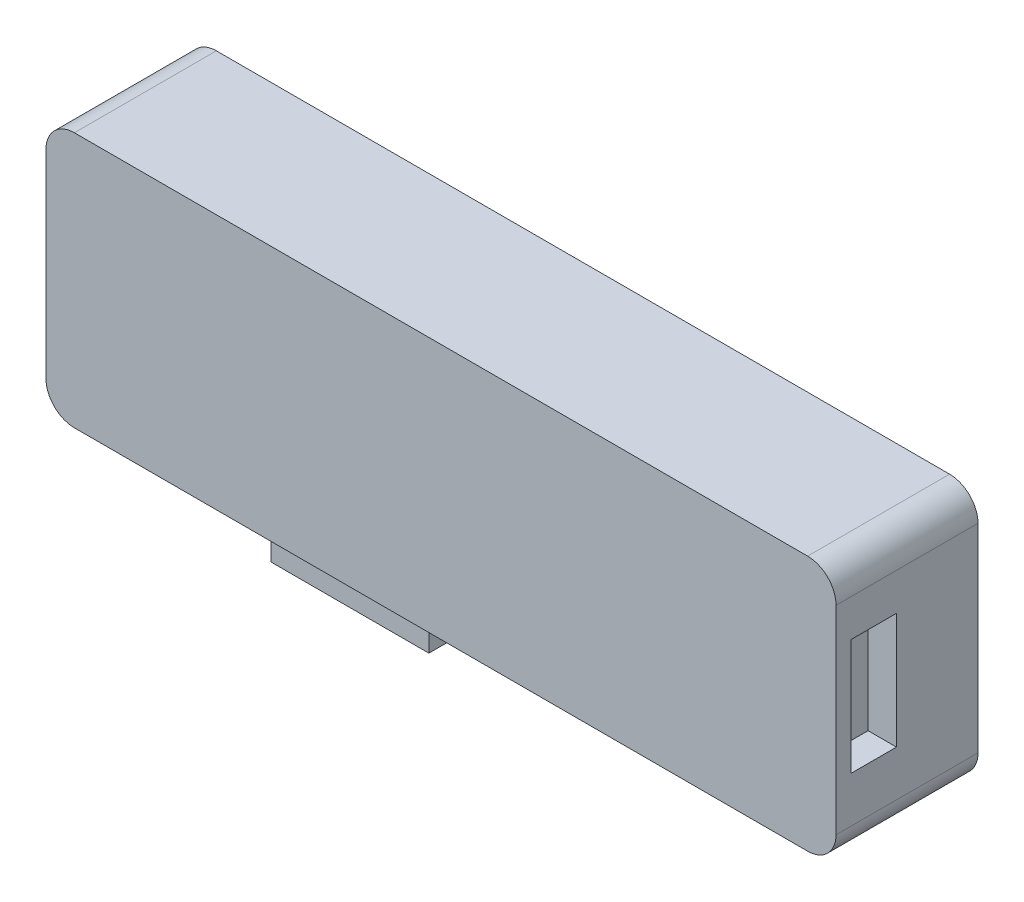
ISO-10303-21;
HEADER;
FILE_DESCRIPTION(('STEP AP214'),'2;1');
FILE_NAME('part.step','',(''),(''),'','','');
FILE_SCHEMA(('AUTOMOTIVE_DESIGN { 1 0 10303 214 1 1 1 1 }'));
ENDSEC;
DATA;
#1=APPLICATION_CONTEXT('core data for automotive mechanical design processes');
#2=APPLICATION_PROTOCOL_DEFINITION('international standard','automotive_design',2000,#1);
#3=PRODUCT_CONTEXT('',#1,'mechanical');
#4=PRODUCT('Part','Part','',(#3));
#5=PRODUCT_RELATED_PRODUCT_CATEGORY('part','',(#4));
#6=PRODUCT_DEFINITION_FORMATION('','',#4);
#7=PRODUCT_DEFINITION_CONTEXT('part definition',#1,'design');
#8=PRODUCT_DEFINITION('design','',#6,#7);
#9=PRODUCT_DEFINITION_SHAPE('','',#8);
#10=(LENGTH_UNIT() NAMED_UNIT(*) SI_UNIT(.MILLI.,.METRE.));
#11=(NAMED_UNIT(*) PLANE_ANGLE_UNIT() SI_UNIT($,.RADIAN.));
#12=(NAMED_UNIT(*) SI_UNIT($,.STERADIAN.) SOLID_ANGLE_UNIT());
#13=UNCERTAINTY_MEASURE_WITH_UNIT(LENGTH_MEASURE(1.E-05),#10,'distance_accuracy_value','');
#14=(GEOMETRIC_REPRESENTATION_CONTEXT(3) GLOBAL_UNCERTAINTY_ASSIGNED_CONTEXT((#13)) GLOBAL_UNIT_ASSIGNED_CONTEXT((#10,
#11,#12)) REPRESENTATION_CONTEXT('',''));
#15=CARTESIAN_POINT('',(0.,0.,0.));
#16=DIRECTION('',(0.,0.,1.));
#17=DIRECTION('',(1.,0.,0.));
#18=AXIS2_PLACEMENT_3D('',#15,#16,#17);
#19=CARTESIAN_POINT('',(-19.05,-11.43,-12.7));
#20=DIRECTION('',(0.,-1.,0.));
#21=DIRECTION('',(0.,0.,-1.));
#22=AXIS2_PLACEMENT_3D('',#19,#20,#21);
#23=PLANE('',#22);
#24=DIRECTION('',(1.,0.,0.));
#25=VECTOR('',#24,1.);
#26=CARTESIAN_POINT('',(-19.05,-11.43,0.));
#27=LINE('',#26,#25);
#28=CARTESIAN_POINT('',(-19.05,-11.43,0.));
#29=VERTEX_POINT('',#28);
#30=CARTESIAN_POINT('',(46.5422120971679,-11.43,0.));
#31=VERTEX_POINT('',#30);
#32=EDGE_CURVE('E232',#29,#31,#27,.T.);
#33=ORIENTED_EDGE('',*,*,#32,.F.);
#34=DIRECTION('',(0.,0.,1.));
#35=VECTOR('',#34,1.);
#36=CARTESIAN_POINT('',(-19.05,-11.43,-12.7));
#37=LINE('',#36,#35);
#38=CARTESIAN_POINT('',(-19.05,-11.43,-12.7));
#39=VERTEX_POINT('',#38);
#40=EDGE_CURVE('E11',#39,#29,#37,.T.);
#41=ORIENTED_EDGE('',*,*,#40,.F.);
#42=DIRECTION('',(1.,0.,0.));
#43=VECTOR('',#42,1.);
#44=CARTESIAN_POINT('',(-19.05,-11.43,-12.7));
#45=LINE('',#44,#43);
#46=CARTESIAN_POINT('',(46.5422120971679,-11.43,-12.7));
#47=VERTEX_POINT('',#46);
#48=EDGE_CURVE('E239',#39,#47,#45,.T.);
#49=ORIENTED_EDGE('',*,*,#48,.T.);
#50=DIRECTION('',(0.,0.,1.));
#51=VECTOR('',#50,1.);
#52=CARTESIAN_POINT('',(46.5422120971679,-11.43,-12.7));
#53=LINE('',#52,#51);
#54=EDGE_CURVE('E37',#47,#31,#53,.T.);
#55=ORIENTED_EDGE('',*,*,#54,.T.);
#56=EDGE_LOOP('',(#33,#41,#49,#55));
#57=FACE_BOUND('',#56,.T.);
#58=DIRECTION('',(-1.,0.,0.));
#59=VECTOR('',#58,1.);
#60=CARTESIAN_POINT('',(9.864,-11.43,-2.794));
#61=LINE('',#60,#59);
#62=CARTESIAN_POINT('',(9.864,-11.43,-2.794));
#63=VERTEX_POINT('',#62);
#64=CARTESIAN_POINT('',(-4.276,-11.43,-2.794));
#65=VERTEX_POINT('',#64);
#66=EDGE_CURVE('E187',#63,#65,#61,.T.);
#67=ORIENTED_EDGE('',*,*,#66,.F.);
#68=DIRECTION('',(0.,0.,1.));
#69=VECTOR('',#68,1.);
#70=CARTESIAN_POINT('',(9.864,-11.43,-2.794));
#71=LINE('',#70,#69);
#72=CARTESIAN_POINT('',(9.864,-11.43,-9.334));
#73=VERTEX_POINT('',#72);
#74=EDGE_CURVE('E181',#73,#63,#71,.T.);
#75=ORIENTED_EDGE('',*,*,#74,.F.);
#76=DIRECTION('',(1.,0.,0.));
#77=VECTOR('',#76,1.);
#78=CARTESIAN_POINT('',(9.864,-11.43,-9.334));
#79=LINE('',#78,#77);
#80=CARTESIAN_POINT('',(-4.276,-11.43,-9.334));
#81=VERTEX_POINT('',#80);
#82=EDGE_CURVE('E591',#81,#73,#79,.T.);
#83=ORIENTED_EDGE('',*,*,#82,.F.);
#84=DIRECTION('',(0.,0.,-1.));
#85=VECTOR('',#84,1.);
#86=CARTESIAN_POINT('',(-4.276,-11.43,-2.794));
#87=LINE('',#86,#85);
#88=EDGE_CURVE('E50',#65,#81,#87,.T.);
#89=ORIENTED_EDGE('',*,*,#88,.F.);
#90=EDGE_LOOP('',(#67,#75,#83,#89));
#91=FACE_BOUND('',#90,.T.);
#92=ADVANCED_FACE('F33',(#57,#91),#23,.T.);
#93=CARTESIAN_POINT('',(-19.05,-8.89,-12.7));
#94=DIRECTION('',(0.,0.,1.));
#95=DIRECTION('',(1.,0.,0.));
#96=AXIS2_PLACEMENT_3D('',#93,#94,#95);
#97=CYLINDRICAL_SURFACE('',#96,2.54);
#98=CARTESIAN_POINT('',(-19.05,-8.89,0.));
#99=DIRECTION('',(0.,0.,-1.));
#100=DIRECTION('',(-1.,0.,0.));
#101=AXIS2_PLACEMENT_3D('',#98,#99,#100);
#102=CIRCLE('',#101,2.54);
#103=CARTESIAN_POINT('',(-21.59,-8.88999999999998,0.));
#104=VERTEX_POINT('',#103);
#105=EDGE_CURVE('E243',#29,#104,#102,.T.);
#106=ORIENTED_EDGE('',*,*,#105,.T.);
#107=DIRECTION('',(0.,0.,1.));
#108=VECTOR('',#107,1.);
#109=CARTESIAN_POINT('',(-21.59,-8.88999999999998,-12.7));
#110=LINE('',#109,#108);
#111=CARTESIAN_POINT('',(-21.59,-8.88999999999998,-12.7));
#112=VERTEX_POINT('',#111);
#113=EDGE_CURVE('E42',#112,#104,#110,.T.);
#114=ORIENTED_EDGE('',*,*,#113,.F.);
#115=CARTESIAN_POINT('',(-19.05,-8.89,-12.7));
#116=DIRECTION('',(0.,0.,-1.));
#117=DIRECTION('',(-1.,0.,0.));
#118=AXIS2_PLACEMENT_3D('',#115,#116,#117);
#119=CIRCLE('',#118,2.54);
#120=EDGE_CURVE('E257',#39,#112,#119,.T.);
#121=ORIENTED_EDGE('',*,*,#120,.F.);
#122=ORIENTED_EDGE('',*,*,#40,.T.);
#123=EDGE_LOOP('',(#106,#114,#121,#122));
#124=FACE_BOUND('',#123,.T.);
#125=ADVANCED_FACE('F306',(#124),#97,.T.);
#126=CARTESIAN_POINT('',(-21.59,-8.88999999999998,-12.7));
#127=DIRECTION('',(1.,0.,0.));
#128=DIRECTION('',(0.,0.,-1.));
#129=AXIS2_PLACEMENT_3D('',#126,#127,#128);
#130=PLANE('',#129);
#131=DIRECTION('',(0.,1.,0.));
#132=VECTOR('',#131,1.);
#133=CARTESIAN_POINT('',(-21.59,-8.88999999999998,0.));
#134=LINE('',#133,#132);
#135=CARTESIAN_POINT('',(-21.59,8.88999999999998,0.));
#136=VERTEX_POINT('',#135);
#137=EDGE_CURVE('E274',#104,#136,#134,.T.);
#138=ORIENTED_EDGE('',*,*,#137,.T.);
#139=DIRECTION('',(0.,0.,1.));
#140=VECTOR('',#139,1.);
#141=CARTESIAN_POINT('',(-21.59,8.88999999999998,-12.7));
#142=LINE('',#141,#140);
#143=CARTESIAN_POINT('',(-21.59,8.88999999999998,-12.7));
#144=VERTEX_POINT('',#143);
#145=EDGE_CURVE('E279',#144,#136,#142,.T.);
#146=ORIENTED_EDGE('',*,*,#145,.F.);
#147=DIRECTION('',(0.,1.,0.));
#148=VECTOR('',#147,1.);
#149=CARTESIAN_POINT('',(-21.59,-8.88999999999998,-12.7));
#150=LINE('',#149,#148);
#151=EDGE_CURVE('E255',#112,#144,#150,.T.);
#152=ORIENTED_EDGE('',*,*,#151,.F.);
#153=ORIENTED_EDGE('',*,*,#113,.T.);
#154=EDGE_LOOP('',(#138,#146,#152,#153));
#155=FACE_BOUND('',#154,.T.);
#156=ADVANCED_FACE('F310',(#155),#130,.F.);
#157=CARTESIAN_POINT('',(-19.05,8.89,-12.7));
#158=DIRECTION('',(0.,0.,1.));
#159=DIRECTION('',(1.,0.,0.));
#160=AXIS2_PLACEMENT_3D('',#157,#158,#159);
#161=CYLINDRICAL_SURFACE('',#160,2.54);
#162=CARTESIAN_POINT('',(-19.05,8.89,0.));
#163=DIRECTION('',(0.,0.,-1.));
#164=DIRECTION('',(-1.,0.,0.));
#165=AXIS2_PLACEMENT_3D('',#162,#163,#164);
#166=CIRCLE('',#165,2.54);
#167=CARTESIAN_POINT('',(-19.05,11.43,0.));
#168=VERTEX_POINT('',#167);
#169=EDGE_CURVE('E272',#136,#168,#166,.T.);
#170=ORIENTED_EDGE('',*,*,#169,.T.);
#171=DIRECTION('',(0.,0.,1.));
#172=VECTOR('',#171,1.);
#173=CARTESIAN_POINT('',(-19.05,11.43,-12.7));
#174=LINE('',#173,#172);
#175=CARTESIAN_POINT('',(-19.05,11.43,-12.7));
#176=VERTEX_POINT('',#175);
#177=EDGE_CURVE('E282',#176,#168,#174,.T.);
#178=ORIENTED_EDGE('',*,*,#177,.F.);
#179=CARTESIAN_POINT('',(-19.05,8.89,-12.7));
#180=DIRECTION('',(0.,0.,-1.));
#181=DIRECTION('',(-1.,0.,0.));
#182=AXIS2_PLACEMENT_3D('',#179,#180,#181);
#183=CIRCLE('',#182,2.54);
#184=EDGE_CURVE('E253',#144,#176,#183,.T.);
#185=ORIENTED_EDGE('',*,*,#184,.F.);
#186=ORIENTED_EDGE('',*,*,#145,.T.);
#187=EDGE_LOOP('',(#170,#178,#185,#186));
#188=FACE_BOUND('',#187,.T.);
#189=ADVANCED_FACE('F330',(#188),#161,.T.);
#190=CARTESIAN_POINT('',(-19.05,11.43,-12.7));
#191=DIRECTION('',(0.,-1.,0.));
#192=DIRECTION('',(0.,0.,-1.));
#193=AXIS2_PLACEMENT_3D('',#190,#191,#192);
#194=PLANE('',#193);
#195=DIRECTION('',(1.,0.,0.));
#196=VECTOR('',#195,1.);
#197=CARTESIAN_POINT('',(-19.05,11.43,0.));
#198=LINE('',#197,#196);
#199=CARTESIAN_POINT('',(46.5422120971679,11.43,0.));
#200=VERTEX_POINT('',#199);
#201=EDGE_CURVE('E270',#168,#200,#198,.T.);
#202=ORIENTED_EDGE('',*,*,#201,.T.);
#203=DIRECTION('',(0.,0.,1.));
#204=VECTOR('',#203,1.);
#205=CARTESIAN_POINT('',(46.5422120971679,11.43,-12.7));
#206=LINE('',#205,#204);
#207=CARTESIAN_POINT('',(46.5422120971679,11.43,-12.7));
#208=VERTEX_POINT('',#207);
#209=EDGE_CURVE('E285',#208,#200,#206,.T.);
#210=ORIENTED_EDGE('',*,*,#209,.F.);
#211=DIRECTION('',(1.,0.,0.));
#212=VECTOR('',#211,1.);
#213=CARTESIAN_POINT('',(-19.05,11.43,-12.7));
#214=LINE('',#213,#212);
#215=EDGE_CURVE('E251',#176,#208,#214,.T.);
#216=ORIENTED_EDGE('',*,*,#215,.F.);
#217=ORIENTED_EDGE('',*,*,#177,.T.);
#218=EDGE_LOOP('',(#202,#210,#216,#217));
#219=FACE_BOUND('',#218,.T.);
#220=ADVANCED_FACE('F328',(#219),#194,.F.);
#221=CARTESIAN_POINT('',(46.542212097168,8.89,-12.7));
#222=DIRECTION('',(0.,0.,1.));
#223=DIRECTION('',(1.,0.,0.));
#224=AXIS2_PLACEMENT_3D('',#221,#222,#223);
#225=CYLINDRICAL_SURFACE('',#224,2.54);
#226=CARTESIAN_POINT('',(46.542212097168,8.89,0.));
#227=DIRECTION('',(0.,0.,-1.));
#228=DIRECTION('',(-1.,0.,0.));
#229=AXIS2_PLACEMENT_3D('',#226,#227,#228);
#230=CIRCLE('',#229,2.54);
#231=CARTESIAN_POINT('',(49.082212097168,8.88999999999998,0.));
#232=VERTEX_POINT('',#231);
#233=EDGE_CURVE('E267',#200,#232,#230,.T.);
#234=ORIENTED_EDGE('',*,*,#233,.T.);
#235=DIRECTION('',(0.,0.,1.));
#236=VECTOR('',#235,1.);
#237=CARTESIAN_POINT('',(49.082212097168,8.88999999999998,-12.7));
#238=LINE('',#237,#236);
#239=CARTESIAN_POINT('',(49.082212097168,8.88999999999998,-12.7));
#240=VERTEX_POINT('',#239);
#241=EDGE_CURVE('E288',#240,#232,#238,.T.);
#242=ORIENTED_EDGE('',*,*,#241,.F.);
#243=CARTESIAN_POINT('',(46.542212097168,8.89,-12.7));
#244=DIRECTION('',(0.,0.,-1.));
#245=DIRECTION('',(-1.,0.,0.));
#246=AXIS2_PLACEMENT_3D('',#243,#244,#245);
#247=CIRCLE('',#246,2.54);
#248=EDGE_CURVE('E249',#208,#240,#247,.T.);
#249=ORIENTED_EDGE('',*,*,#248,.F.);
#250=ORIENTED_EDGE('',*,*,#209,.T.);
#251=EDGE_LOOP('',(#234,#242,#249,#250));
#252=FACE_BOUND('',#251,.T.);
#253=ADVANCED_FACE('F324',(#252),#225,.T.);
#254=CARTESIAN_POINT('',(49.082212097168,-8.88999999999998,-12.7));
#255=DIRECTION('',(1.,0.,0.));
#256=DIRECTION('',(0.,0.,-1.));
#257=AXIS2_PLACEMENT_3D('',#254,#255,#256);
#258=PLANE('',#257);
#259=DIRECTION('',(0.,1.,0.));
#260=VECTOR('',#259,1.);
#261=CARTESIAN_POINT('',(49.082212097168,-4.7991640521255,-5.40803669244056));
#262=LINE('',#261,#260);
#263=CARTESIAN_POINT('',(49.082212097168,-4.7991640521255,-5.40803669244056));
#264=VERTEX_POINT('',#263);
#265=CARTESIAN_POINT('',(49.082212097168,5.56528687011896,-5.40803669244056));
#266=VERTEX_POINT('',#265);
#267=EDGE_CURVE('E204',#264,#266,#262,.T.);
#268=ORIENTED_EDGE('',*,*,#267,.F.);
#269=DIRECTION('',(0.,0.,-1.));
#270=VECTOR('',#269,1.);
#271=CARTESIAN_POINT('',(49.082212097168,-4.7991640521255,-1.31739544409521));
#272=LINE('',#271,#270);
#273=CARTESIAN_POINT('',(49.082212097168,-4.7991640521255,-1.31739544409521));
#274=VERTEX_POINT('',#273);
#275=EDGE_CURVE('E211',#274,#264,#272,.T.);
#276=ORIENTED_EDGE('',*,*,#275,.F.);
#277=DIRECTION('',(0.,-1.,0.));
#278=VECTOR('',#277,1.);
#279=CARTESIAN_POINT('',(49.082212097168,-4.7991640521255,-1.31739544409521));
#280=LINE('',#279,#278);
#281=CARTESIAN_POINT('',(49.082212097168,5.56528687011896,-1.31739544409521));
#282=VERTEX_POINT('',#281);
#283=EDGE_CURVE('E225',#282,#274,#280,.T.);
#284=ORIENTED_EDGE('',*,*,#283,.F.);
#285=DIRECTION('',(0.,0.,1.));
#286=VECTOR('',#285,1.);
#287=CARTESIAN_POINT('',(49.082212097168,5.56528687011896,-1.31739544409521));
#288=LINE('',#287,#286);
#289=EDGE_CURVE('E222',#266,#282,#288,.T.);
#290=ORIENTED_EDGE('',*,*,#289,.F.);
#291=EDGE_LOOP('',(#268,#276,#284,#290));
#292=FACE_BOUND('',#291,.T.);
#293=DIRECTION('',(0.,1.,0.));
#294=VECTOR('',#293,1.);
#295=CARTESIAN_POINT('',(49.082212097168,-8.88999999999998,0.));
#296=LINE('',#295,#294);
#297=CARTESIAN_POINT('',(49.082212097168,-8.88999999999998,0.));
#298=VERTEX_POINT('',#297);
#299=EDGE_CURVE('E264',#298,#232,#296,.T.);
#300=ORIENTED_EDGE('',*,*,#299,.F.);
#301=DIRECTION('',(0.,0.,1.));
#302=VECTOR('',#301,1.);
#303=CARTESIAN_POINT('',(49.082212097168,-8.88999999999998,-12.7));
#304=LINE('',#303,#302);
#305=CARTESIAN_POINT('',(49.082212097168,-8.88999999999998,-12.7));
#306=VERTEX_POINT('',#305);
#307=EDGE_CURVE('E289',#306,#298,#304,.T.);
#308=ORIENTED_EDGE('',*,*,#307,.F.);
#309=DIRECTION('',(0.,1.,0.));
#310=VECTOR('',#309,1.);
#311=CARTESIAN_POINT('',(49.082212097168,-8.88999999999998,-12.7));
#312=LINE('',#311,#310);
#313=EDGE_CURVE('E246',#306,#240,#312,.T.);
#314=ORIENTED_EDGE('',*,*,#313,.T.);
#315=ORIENTED_EDGE('',*,*,#241,.T.);
#316=EDGE_LOOP('',(#300,#308,#314,#315));
#317=FACE_BOUND('',#316,.T.);
#318=ADVANCED_FACE('F320',(#292,#317),#258,.T.);
#319=CARTESIAN_POINT('',(46.542212097168,-8.89,-12.7));
#320=DIRECTION('',(0.,0.,1.));
#321=DIRECTION('',(1.,0.,0.));
#322=AXIS2_PLACEMENT_3D('',#319,#320,#321);
#323=CYLINDRICAL_SURFACE('',#322,2.54);
#324=CARTESIAN_POINT('',(46.542212097168,-8.89,0.));
#325=DIRECTION('',(0.,0.,1.));
#326=DIRECTION('',(1.,0.,0.));
#327=AXIS2_PLACEMENT_3D('',#324,#325,#326);
#328=CIRCLE('',#327,2.54);
#329=EDGE_CURVE('E261',#31,#298,#328,.T.);
#330=ORIENTED_EDGE('',*,*,#329,.F.);
#331=ORIENTED_EDGE('',*,*,#54,.F.);
#332=CARTESIAN_POINT('',(46.542212097168,-8.89,-12.7));
#333=DIRECTION('',(0.,0.,1.));
#334=DIRECTION('',(1.,0.,0.));
#335=AXIS2_PLACEMENT_3D('',#332,#333,#334);
#336=CIRCLE('',#335,2.54);
#337=EDGE_CURVE('E242',#47,#306,#336,.T.);
#338=ORIENTED_EDGE('',*,*,#337,.T.);
#339=ORIENTED_EDGE('',*,*,#307,.T.);
#340=EDGE_LOOP('',(#330,#331,#338,#339));
#341=FACE_BOUND('',#340,.T.);
#342=ADVANCED_FACE('F298',(#341),#323,.T.);
#343=CARTESIAN_POINT('',(46.542212097168,-8.89,-12.7));
#344=DIRECTION('',(0.,0.,1.));
#345=DIRECTION('',(1.,0.,0.));
#346=AXIS2_PLACEMENT_3D('',#343,#344,#345);
#347=PLANE('',#346);
#348=ORIENTED_EDGE('',*,*,#48,.F.);
#349=ORIENTED_EDGE('',*,*,#120,.T.);
#350=ORIENTED_EDGE('',*,*,#151,.T.);
#351=ORIENTED_EDGE('',*,*,#184,.T.);
#352=ORIENTED_EDGE('',*,*,#215,.T.);
#353=ORIENTED_EDGE('',*,*,#248,.T.);
#354=ORIENTED_EDGE('',*,*,#313,.F.);
#355=ORIENTED_EDGE('',*,*,#337,.F.);
#356=EDGE_LOOP('',(#348,#349,#350,#351,#352,#353,#354,#355));
#357=FACE_BOUND('',#356,.T.);
#358=ADVANCED_FACE('F314',(#357),#347,.F.);
#359=CARTESIAN_POINT('',(46.542212097168,-8.89,0.));
#360=DIRECTION('',(0.,0.,1.));
#361=DIRECTION('',(1.,0.,0.));
#362=AXIS2_PLACEMENT_3D('',#359,#360,#361);
#363=PLANE('',#362);
#364=ORIENTED_EDGE('',*,*,#32,.T.);
#365=ORIENTED_EDGE('',*,*,#329,.T.);
#366=ORIENTED_EDGE('',*,*,#299,.T.);
#367=ORIENTED_EDGE('',*,*,#233,.F.);
#368=ORIENTED_EDGE('',*,*,#201,.F.);
#369=ORIENTED_EDGE('',*,*,#169,.F.);
#370=ORIENTED_EDGE('',*,*,#137,.F.);
#371=ORIENTED_EDGE('',*,*,#105,.F.);
#372=EDGE_LOOP('',(#364,#365,#366,#367,#368,#369,#370,#371));
#373=FACE_BOUND('',#372,.T.);
#374=ADVANCED_FACE('F301',(#373),#363,.T.);
#375=CARTESIAN_POINT('',(46.542212097168,-4.7991640521255,-5.40803669244056));
#376=DIRECTION('',(0.,0.,-1.));
#377=DIRECTION('',(-1.,0.,0.));
#378=AXIS2_PLACEMENT_3D('',#375,#376,#377);
#379=PLANE('',#378);
#380=ORIENTED_EDGE('',*,*,#267,.T.);
#381=DIRECTION('',(1.,0.,0.));
#382=VECTOR('',#381,1.);
#383=CARTESIAN_POINT('',(46.542212097168,5.56528687011896,-5.40803669244056));
#384=LINE('',#383,#382);
#385=CARTESIAN_POINT('',(46.542212097168,5.56528687011896,-5.40803669244056));
#386=VERTEX_POINT('',#385);
#387=EDGE_CURVE('E220',#386,#266,#384,.T.);
#388=ORIENTED_EDGE('',*,*,#387,.F.);
#389=DIRECTION('',(0.,1.,0.));
#390=VECTOR('',#389,1.);
#391=CARTESIAN_POINT('',(46.542212097168,-4.7991640521255,-5.40803669244056));
#392=LINE('',#391,#390);
#393=CARTESIAN_POINT('',(46.542212097168,-4.7991640521255,-5.40803669244056));
#394=VERTEX_POINT('',#393);
#395=EDGE_CURVE('E207',#394,#386,#392,.T.);
#396=ORIENTED_EDGE('',*,*,#395,.F.);
#397=DIRECTION('',(1.,0.,0.));
#398=VECTOR('',#397,1.);
#399=CARTESIAN_POINT('',(46.542212097168,-4.7991640521255,-5.40803669244056));
#400=LINE('',#399,#398);
#401=EDGE_CURVE('E230',#394,#264,#400,.T.);
#402=ORIENTED_EDGE('',*,*,#401,.T.);
#403=EDGE_LOOP('',(#380,#388,#396,#402));
#404=FACE_BOUND('',#403,.T.);
#405=ADVANCED_FACE('F371',(#404),#379,.F.);
#406=CARTESIAN_POINT('',(46.542212097168,-4.7991640521255,-1.31739544409521));
#407=DIRECTION('',(0.,-1.,0.));
#408=DIRECTION('',(0.,0.,-1.));
#409=AXIS2_PLACEMENT_3D('',#406,#407,#408);
#410=PLANE('',#409);
#411=ORIENTED_EDGE('',*,*,#275,.T.);
#412=ORIENTED_EDGE('',*,*,#401,.F.);
#413=DIRECTION('',(0.,0.,-1.));
#414=VECTOR('',#413,1.);
#415=CARTESIAN_POINT('',(46.542212097168,-4.7991640521255,-1.31739544409521));
#416=LINE('',#415,#414);
#417=CARTESIAN_POINT('',(46.542212097168,-4.7991640521255,-1.31739544409521));
#418=VERTEX_POINT('',#417);
#419=EDGE_CURVE('E217',#418,#394,#416,.T.);
#420=ORIENTED_EDGE('',*,*,#419,.F.);
#421=DIRECTION('',(1.,0.,0.));
#422=VECTOR('',#421,1.);
#423=CARTESIAN_POINT('',(46.542212097168,-4.7991640521255,-1.31739544409521));
#424=LINE('',#423,#422);
#425=EDGE_CURVE('E233',#418,#274,#424,.T.);
#426=ORIENTED_EDGE('',*,*,#425,.T.);
#427=EDGE_LOOP('',(#411,#412,#420,#426));
#428=FACE_BOUND('',#427,.T.);
#429=ADVANCED_FACE('F367',(#428),#410,.F.);
#430=CARTESIAN_POINT('',(46.542212097168,-4.7991640521255,-1.31739544409521));
#431=DIRECTION('',(0.,0.,1.));
#432=DIRECTION('',(1.,0.,0.));
#433=AXIS2_PLACEMENT_3D('',#430,#431,#432);
#434=PLANE('',#433);
#435=ORIENTED_EDGE('',*,*,#283,.T.);
#436=ORIENTED_EDGE('',*,*,#425,.F.);
#437=DIRECTION('',(0.,-1.,0.));
#438=VECTOR('',#437,1.);
#439=CARTESIAN_POINT('',(46.542212097168,-4.7991640521255,-1.31739544409521));
#440=LINE('',#439,#438);
#441=CARTESIAN_POINT('',(46.542212097168,5.56528687011896,-1.31739544409521));
#442=VERTEX_POINT('',#441);
#443=EDGE_CURVE('E214',#442,#418,#440,.T.);
#444=ORIENTED_EDGE('',*,*,#443,.F.);
#445=DIRECTION('',(1.,0.,0.));
#446=VECTOR('',#445,1.);
#447=CARTESIAN_POINT('',(46.542212097168,5.56528687011896,-1.31739544409521));
#448=LINE('',#447,#446);
#449=EDGE_CURVE('E235',#442,#282,#448,.T.);
#450=ORIENTED_EDGE('',*,*,#449,.T.);
#451=EDGE_LOOP('',(#435,#436,#444,#450));
#452=FACE_BOUND('',#451,.T.);
#453=ADVANCED_FACE('F370',(#452),#434,.F.);
#454=CARTESIAN_POINT('',(46.542212097168,5.56528687011896,-1.31739544409521));
#455=DIRECTION('',(0.,1.,0.));
#456=DIRECTION('',(0.,0.,1.));
#457=AXIS2_PLACEMENT_3D('',#454,#455,#456);
#458=PLANE('',#457);
#459=ORIENTED_EDGE('',*,*,#289,.T.);
#460=ORIENTED_EDGE('',*,*,#449,.F.);
#461=DIRECTION('',(0.,0.,1.));
#462=VECTOR('',#461,1.);
#463=CARTESIAN_POINT('',(46.542212097168,5.56528687011896,-1.31739544409521));
#464=LINE('',#463,#462);
#465=EDGE_CURVE('E210',#386,#442,#464,.T.);
#466=ORIENTED_EDGE('',*,*,#465,.F.);
#467=ORIENTED_EDGE('',*,*,#387,.T.);
#468=EDGE_LOOP('',(#459,#460,#466,#467));
#469=FACE_BOUND('',#468,.T.);
#470=ADVANCED_FACE('F365',(#469),#458,.F.);
#471=CARTESIAN_POINT('',(46.542212097168,0.,0.));
#472=DIRECTION('',(-1.,0.,0.));
#473=DIRECTION('',(0.,0.,1.));
#474=AXIS2_PLACEMENT_3D('',#471,#472,#473);
#475=PLANE('',#474);
#476=ORIENTED_EDGE('',*,*,#395,.T.);
#477=ORIENTED_EDGE('',*,*,#465,.T.);
#478=ORIENTED_EDGE('',*,*,#443,.T.);
#479=ORIENTED_EDGE('',*,*,#419,.T.);
#480=EDGE_LOOP('',(#476,#477,#478,#479));
#481=FACE_BOUND('',#480,.T.);
#482=ADVANCED_FACE('F361',(#481),#475,.F.);
#483=CARTESIAN_POINT('',(9.864,-32.4197639000157,-2.794));
#484=DIRECTION('',(-1.,0.,0.));
#485=DIRECTION('',(0.,0.,1.));
#486=AXIS2_PLACEMENT_3D('',#483,#484,#485);
#487=PLANE('',#486);
#488=DIRECTION('',(0.,1.,0.));
#489=VECTOR('',#488,1.);
#490=CARTESIAN_POINT('',(9.864,-32.4197639000157,-2.794));
#491=LINE('',#490,#489);
#492=CARTESIAN_POINT('',(9.864,-15.8245726501465,-2.794));
#493=VERTEX_POINT('',#492);
#494=EDGE_CURVE('E180',#493,#63,#491,.T.);
#495=ORIENTED_EDGE('',*,*,#494,.F.);
#496=DIRECTION('',(0.,0.,-1.));
#497=VECTOR('',#496,1.);
#498=CARTESIAN_POINT('',(9.864,-15.8245726501465,-2.79399999999999));
#499=LINE('',#498,#497);
#500=CARTESIAN_POINT('',(9.864,-15.8245726501465,-9.334));
#501=VERTEX_POINT('',#500);
#502=EDGE_CURVE('E177',#493,#501,#499,.T.);
#503=ORIENTED_EDGE('',*,*,#502,.T.);
#504=DIRECTION('',(0.,1.,0.));
#505=VECTOR('',#504,1.);
#506=CARTESIAN_POINT('',(9.864,-32.4197639000157,-9.334));
#507=LINE('',#506,#505);
#508=EDGE_CURVE('E578',#501,#73,#507,.T.);
#509=ORIENTED_EDGE('',*,*,#508,.T.);
#510=ORIENTED_EDGE('',*,*,#74,.T.);
#511=EDGE_LOOP('',(#495,#503,#509,#510));
#512=FACE_BOUND('',#511,.T.);
#513=ADVANCED_FACE('F364',(#512),#487,.F.);
#514=CARTESIAN_POINT('',(9.864,-32.4197639000157,-2.794));
#515=DIRECTION('',(0.,0.,-1.));
#516=DIRECTION('',(-1.,0.,0.));
#517=AXIS2_PLACEMENT_3D('',#514,#515,#516);
#518=PLANE('',#517);
#519=DIRECTION('',(0.,1.,0.));
#520=VECTOR('',#519,1.);
#521=CARTESIAN_POINT('',(-4.276,-32.4197639000157,-2.794));
#522=LINE('',#521,#520);
#523=CARTESIAN_POINT('',(-4.276,-15.8245726501465,-2.794));
#524=VERTEX_POINT('',#523);
#525=EDGE_CURVE('E184',#524,#65,#522,.T.);
#526=ORIENTED_EDGE('',*,*,#525,.F.);
#527=DIRECTION('',(1.,0.,0.));
#528=VECTOR('',#527,1.);
#529=CARTESIAN_POINT('',(9.864,-15.8245726501465,-2.794));
#530=LINE('',#529,#528);
#531=EDGE_CURVE('E171',#524,#493,#530,.T.);
#532=ORIENTED_EDGE('',*,*,#531,.T.);
#533=ORIENTED_EDGE('',*,*,#494,.T.);
#534=ORIENTED_EDGE('',*,*,#66,.T.);
#535=EDGE_LOOP('',(#526,#532,#533,#534));
#536=FACE_BOUND('',#535,.T.);
#537=ADVANCED_FACE('F185',(#536),#518,.F.);
#538=CARTESIAN_POINT('',(-4.276,-32.4197639000157,-2.794));
#539=DIRECTION('',(1.,0.,0.));
#540=DIRECTION('',(0.,0.,-1.));
#541=AXIS2_PLACEMENT_3D('',#538,#539,#540);
#542=PLANE('',#541);
#543=DIRECTION('',(0.,1.,0.));
#544=VECTOR('',#543,1.);
#545=CARTESIAN_POINT('',(-4.276,-32.4197639000157,-9.334));
#546=LINE('',#545,#544);
#547=CARTESIAN_POINT('',(-4.276,-15.8245726501465,-9.334));
#548=VERTEX_POINT('',#547);
#549=EDGE_CURVE('E190',#548,#81,#546,.T.);
#550=ORIENTED_EDGE('',*,*,#549,.F.);
#551=DIRECTION('',(0.,0.,1.));
#552=VECTOR('',#551,1.);
#553=CARTESIAN_POINT('',(-4.276,-15.8245726501465,-2.79399999999999));
#554=LINE('',#553,#552);
#555=EDGE_CURVE('E175',#548,#524,#554,.T.);
#556=ORIENTED_EDGE('',*,*,#555,.T.);
#557=ORIENTED_EDGE('',*,*,#525,.T.);
#558=ORIENTED_EDGE('',*,*,#88,.T.);
#559=EDGE_LOOP('',(#550,#556,#557,#558));
#560=FACE_BOUND('',#559,.T.);
#561=ADVANCED_FACE('F189',(#560),#542,.F.);
#562=CARTESIAN_POINT('',(9.864,-32.4197639000157,-9.334));
#563=DIRECTION('',(0.,0.,1.));
#564=DIRECTION('',(1.,0.,0.));
#565=AXIS2_PLACEMENT_3D('',#562,#563,#564);
#566=PLANE('',#565);
#567=ORIENTED_EDGE('',*,*,#508,.F.);
#568=DIRECTION('',(-1.,0.,0.));
#569=VECTOR('',#568,1.);
#570=CARTESIAN_POINT('',(9.864,-15.8245726501465,-9.334));
#571=LINE('',#570,#569);
#572=EDGE_CURVE('E196',#501,#548,#571,.T.);
#573=ORIENTED_EDGE('',*,*,#572,.T.);
#574=ORIENTED_EDGE('',*,*,#549,.T.);
#575=ORIENTED_EDGE('',*,*,#82,.T.);
#576=EDGE_LOOP('',(#567,#573,#574,#575));
#577=FACE_BOUND('',#576,.T.);
#578=ADVANCED_FACE('F430',(#577),#566,.F.);
#579=CARTESIAN_POINT('',(5.298,-32.4197639000157,-4.81));
#580=DIRECTION('',(0.,0.,-1.));
#581=DIRECTION('',(-1.,0.,0.));
#582=AXIS2_PLACEMENT_3D('',#579,#580,#581);
#583=PLANE('',#582);
#584=DIRECTION('',(1.,0.,0.));
#585=VECTOR('',#584,1.);
#586=CARTESIAN_POINT('',(5.298,-15.8245726501465,-4.81));
#587=LINE('',#586,#585);
#588=CARTESIAN_POINT('',(0.290000000000004,-15.8245726501465,-4.81));
#589=VERTEX_POINT('',#588);
#590=CARTESIAN_POINT('',(5.298,-15.8245726501465,-4.81));
#591=VERTEX_POINT('',#590);
#592=EDGE_CURVE('E198',#589,#591,#587,.T.);
#593=ORIENTED_EDGE('',*,*,#592,.F.);
#594=DIRECTION('',(0.,1.,0.));
#595=VECTOR('',#594,1.);
#596=CARTESIAN_POINT('',(0.290000000000004,-32.4197639000157,-4.81));
#597=LINE('',#596,#595);
#598=CARTESIAN_POINT('',(0.290000000000006,-11.43,-4.81));
#599=VERTEX_POINT('',#598);
#600=EDGE_CURVE('E575',#589,#599,#597,.T.);
#601=ORIENTED_EDGE('',*,*,#600,.T.);
#602=DIRECTION('',(-1.,0.,0.));
#603=VECTOR('',#602,1.);
#604=CARTESIAN_POINT('',(5.298,-11.43,-4.81));
#605=LINE('',#604,#603);
#606=CARTESIAN_POINT('',(5.298,-11.43,-4.81));
#607=VERTEX_POINT('',#606);
#608=EDGE_CURVE('E58',#607,#599,#605,.T.);
#609=ORIENTED_EDGE('',*,*,#608,.F.);
#610=DIRECTION('',(0.,1.,0.));
#611=VECTOR('',#610,1.);
#612=CARTESIAN_POINT('',(5.298,-32.4197639000157,-4.81));
#613=LINE('',#612,#611);
#614=EDGE_CURVE('E201',#591,#607,#613,.T.);
#615=ORIENTED_EDGE('',*,*,#614,.F.);
#616=EDGE_LOOP('',(#593,#601,#609,#615));
#617=FACE_BOUND('',#616,.T.);
#618=ADVANCED_FACE('F359',(#617),#583,.T.);
#619=CARTESIAN_POINT('',(0.290000000000004,-32.4197639000157,-4.81));
#620=DIRECTION('',(1.,0.,0.));
#621=DIRECTION('',(0.,0.,-1.));
#622=AXIS2_PLACEMENT_3D('',#619,#620,#621);
#623=PLANE('',#622);
#624=DIRECTION('',(0.,0.,1.));
#625=VECTOR('',#624,1.);
#626=CARTESIAN_POINT('',(0.290000000000004,-15.8245726501465,-4.80999999999999));
#627=LINE('',#626,#625);
#628=CARTESIAN_POINT('',(0.290000000000004,-15.8245726501465,-7.318));
#629=VERTEX_POINT('',#628);
#630=EDGE_CURVE('E202',#629,#589,#627,.T.);
#631=ORIENTED_EDGE('',*,*,#630,.F.);
#632=DIRECTION('',(0.,1.,0.));
#633=VECTOR('',#632,1.);
#634=CARTESIAN_POINT('',(0.290000000000004,-32.4197639000157,-7.318));
#635=LINE('',#634,#633);
#636=CARTESIAN_POINT('',(0.290000000000006,-11.43,-7.318));
#637=VERTEX_POINT('',#636);
#638=EDGE_CURVE('E568',#629,#637,#635,.T.);
#639=ORIENTED_EDGE('',*,*,#638,.T.);
#640=DIRECTION('',(0.,0.,-1.));
#641=VECTOR('',#640,1.);
#642=CARTESIAN_POINT('',(0.290000000000004,-11.43,-4.81));
#643=LINE('',#642,#641);
#644=EDGE_CURVE('E582',#599,#637,#643,.T.);
#645=ORIENTED_EDGE('',*,*,#644,.F.);
#646=ORIENTED_EDGE('',*,*,#600,.F.);
#647=EDGE_LOOP('',(#631,#639,#645,#646));
#648=FACE_BOUND('',#647,.T.);
#649=ADVANCED_FACE('F444',(#648),#623,.T.);
#650=CARTESIAN_POINT('',(5.298,-32.4197639000157,-7.318));
#651=DIRECTION('',(0.,0.,1.));
#652=DIRECTION('',(1.,0.,0.));
#653=AXIS2_PLACEMENT_3D('',#650,#651,#652);
#654=PLANE('',#653);
#655=DIRECTION('',(-1.,0.,0.));
#656=VECTOR('',#655,1.);
#657=CARTESIAN_POINT('',(5.298,-15.8245726501465,-7.318));
#658=LINE('',#657,#656);
#659=CARTESIAN_POINT('',(5.298,-15.8245726501465,-7.318));
#660=VERTEX_POINT('',#659);
#661=EDGE_CURVE('E205',#660,#629,#658,.T.);
#662=ORIENTED_EDGE('',*,*,#661,.F.);
#663=DIRECTION('',(0.,1.,0.));
#664=VECTOR('',#663,1.);
#665=CARTESIAN_POINT('',(5.298,-32.4197639000157,-7.318));
#666=LINE('',#665,#664);
#667=CARTESIAN_POINT('',(5.298,-11.43,-7.318));
#668=VERTEX_POINT('',#667);
#669=EDGE_CURVE('E565',#660,#668,#666,.T.);
#670=ORIENTED_EDGE('',*,*,#669,.T.);
#671=DIRECTION('',(1.,0.,0.));
#672=VECTOR('',#671,1.);
#673=CARTESIAN_POINT('',(5.298,-11.43,-7.318));
#674=LINE('',#673,#672);
#675=EDGE_CURVE('E579',#637,#668,#674,.T.);
#676=ORIENTED_EDGE('',*,*,#675,.F.);
#677=ORIENTED_EDGE('',*,*,#638,.F.);
#678=EDGE_LOOP('',(#662,#670,#676,#677));
#679=FACE_BOUND('',#678,.T.);
#680=ADVANCED_FACE('F354',(#679),#654,.T.);
#681=CARTESIAN_POINT('',(5.298,-32.4197639000157,-4.81));
#682=DIRECTION('',(-1.,0.,0.));
#683=DIRECTION('',(0.,0.,1.));
#684=AXIS2_PLACEMENT_3D('',#681,#682,#683);
#685=PLANE('',#684);
#686=DIRECTION('',(0.,0.,-1.));
#687=VECTOR('',#686,1.);
#688=CARTESIAN_POINT('',(5.298,-15.8245726501465,-4.80999999999999));
#689=LINE('',#688,#687);
#690=EDGE_CURVE('E200',#591,#660,#689,.T.);
#691=ORIENTED_EDGE('',*,*,#690,.F.);
#692=ORIENTED_EDGE('',*,*,#614,.T.);
#693=DIRECTION('',(0.,0.,1.));
#694=VECTOR('',#693,1.);
#695=CARTESIAN_POINT('',(5.298,-11.43,-4.81));
#696=LINE('',#695,#694);
#697=EDGE_CURVE('E572',#668,#607,#696,.T.);
#698=ORIENTED_EDGE('',*,*,#697,.F.);
#699=ORIENTED_EDGE('',*,*,#669,.F.);
#700=EDGE_LOOP('',(#691,#692,#698,#699));
#701=FACE_BOUND('',#700,.T.);
#702=ADVANCED_FACE('F348',(#701),#685,.T.);
#703=CARTESIAN_POINT('',(-3.006,-15.8245726501465,-8.064));
#704=DIRECTION('',(0.,1.,0.));
#705=DIRECTION('',(0.,0.,1.));
#706=AXIS2_PLACEMENT_3D('',#703,#704,#705);
#707=PLANE('',#706);
#708=ORIENTED_EDGE('',*,*,#592,.T.);
#709=ORIENTED_EDGE('',*,*,#690,.T.);
#710=ORIENTED_EDGE('',*,*,#661,.T.);
#711=ORIENTED_EDGE('',*,*,#630,.T.);
#712=EDGE_LOOP('',(#708,#709,#710,#711));
#713=FACE_BOUND('',#712,.T.);
#714=ORIENTED_EDGE('',*,*,#531,.F.);
#715=ORIENTED_EDGE('',*,*,#555,.F.);
#716=ORIENTED_EDGE('',*,*,#572,.F.);
#717=ORIENTED_EDGE('',*,*,#502,.F.);
#718=EDGE_LOOP('',(#714,#715,#716,#717));
#719=FACE_BOUND('',#718,.T.);
#720=ADVANCED_FACE('F173',(#713,#719),#707,.F.);
#721=ORIENTED_EDGE('',*,*,#608,.T.);
#722=ORIENTED_EDGE('',*,*,#644,.T.);
#723=ORIENTED_EDGE('',*,*,#675,.T.);
#724=ORIENTED_EDGE('',*,*,#697,.T.);
#725=EDGE_LOOP('',(#721,#722,#723,#724));
#726=FACE_BOUND('',#725,.T.);
#727=ADVANCED_FACE('F35',(#726),#23,.T.);
#728=CLOSED_SHELL('',(#92,#125,#156,#189,#220,#253,#318,#342,#358,#374,#405,#429,#453,#470,#482,
#513,#537,#561,#578,#618,#649,#680,#702,#720,#727));
#729=MANIFOLD_SOLID_BREP('B2',#728);
#730=ADVANCED_BREP_SHAPE_REPRESENTATION('',(#18,#729),#14);
#731=SHAPE_DEFINITION_REPRESENTATION(#9,#730);
ENDSEC;
END-ISO-10303-21;
